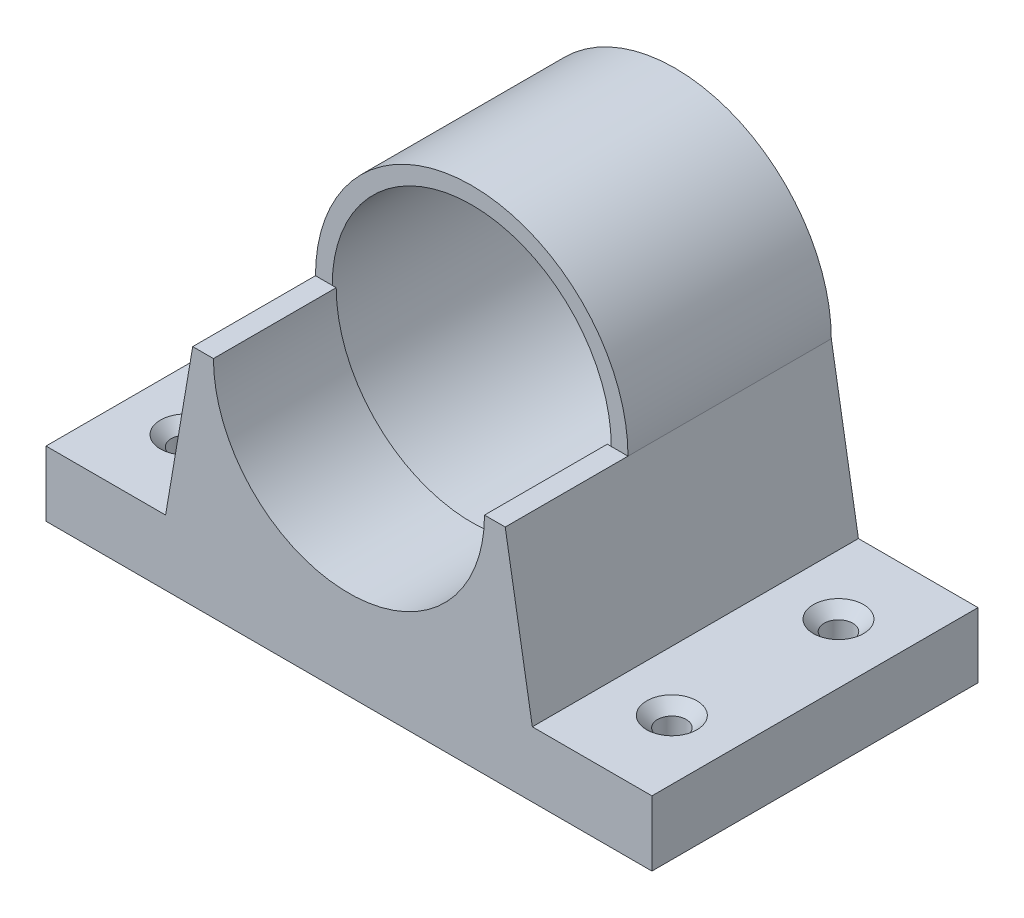
ISO-10303-21;
HEADER;
FILE_DESCRIPTION(('STEP AP214'),'2;1');
FILE_NAME('part.step','',(''),(''),'','','');
FILE_SCHEMA(('AUTOMOTIVE_DESIGN { 1 0 10303 214 1 1 1 1 }'));
ENDSEC;
DATA;
#1=APPLICATION_CONTEXT('core data for automotive mechanical design processes');
#2=APPLICATION_PROTOCOL_DEFINITION('international standard','automotive_design',2000,#1);
#3=PRODUCT_CONTEXT('',#1,'mechanical');
#4=PRODUCT('Part','Part','',(#3));
#5=PRODUCT_RELATED_PRODUCT_CATEGORY('part','',(#4));
#6=PRODUCT_DEFINITION_FORMATION('','',#4);
#7=PRODUCT_DEFINITION_CONTEXT('part definition',#1,'design');
#8=PRODUCT_DEFINITION('design','',#6,#7);
#9=PRODUCT_DEFINITION_SHAPE('','',#8);
#10=(LENGTH_UNIT() NAMED_UNIT(*) SI_UNIT(.MILLI.,.METRE.));
#11=(NAMED_UNIT(*) PLANE_ANGLE_UNIT() SI_UNIT($,.RADIAN.));
#12=(NAMED_UNIT(*) SI_UNIT($,.STERADIAN.) SOLID_ANGLE_UNIT());
#13=UNCERTAINTY_MEASURE_WITH_UNIT(LENGTH_MEASURE(1.E-05),#10,'distance_accuracy_value','');
#14=(GEOMETRIC_REPRESENTATION_CONTEXT(3) GLOBAL_UNCERTAINTY_ASSIGNED_CONTEXT((#13)) GLOBAL_UNIT_ASSIGNED_CONTEXT((#10,
#11,#12)) REPRESENTATION_CONTEXT('',''));
#15=CARTESIAN_POINT('',(0.,0.,0.));
#16=DIRECTION('',(0.,0.,1.));
#17=DIRECTION('',(1.,0.,0.));
#18=AXIS2_PLACEMENT_3D('',#15,#16,#17);
#19=CARTESIAN_POINT('',(0.,18.1533956791324,0.));
#20=DIRECTION('',(0.,0.,-1.));
#21=DIRECTION('',(-1.,0.,0.));
#22=AXIS2_PLACEMENT_3D('',#19,#20,#21);
#23=PLANE('',#22);
#24=CARTESIAN_POINT('',(0.,18.1533956791324,0.));
#25=DIRECTION('',(0.,0.,1.));
#26=DIRECTION('',(1.,0.,0.));
#27=AXIS2_PLACEMENT_3D('',#24,#25,#26);
#28=CIRCLE('',#27,17.5);
#29=CARTESIAN_POINT('',(17.5,18.1533956791324,0.));
#30=VERTEX_POINT('',#29);
#31=CARTESIAN_POINT('',(-17.5,18.1533956791324,0.));
#32=VERTEX_POINT('',#31);
#33=EDGE_CURVE('E300',#30,#32,#28,.T.);
#34=ORIENTED_EDGE('',*,*,#33,.F.);
#35=DIRECTION('',(1.,0.,0.));
#36=VECTOR('',#35,1.);
#37=CARTESIAN_POINT('',(0.,18.1533956791324,0.));
#38=LINE('',#37,#36);
#39=CARTESIAN_POINT('',(19.6,18.1533956791324,0.));
#40=VERTEX_POINT('',#39);
#41=EDGE_CURVE('E196',#30,#40,#38,.T.);
#42=ORIENTED_EDGE('',*,*,#41,.T.);
#43=CARTESIAN_POINT('',(0.,18.1533956791324,0.));
#44=DIRECTION('',(0.,0.,1.));
#45=DIRECTION('',(1.,0.,0.));
#46=AXIS2_PLACEMENT_3D('',#43,#44,#45);
#47=CIRCLE('',#46,19.6);
#48=CARTESIAN_POINT('',(-19.6,18.1533956791324,0.));
#49=VERTEX_POINT('',#48);
#50=EDGE_CURVE('E58',#40,#49,#47,.T.);
#51=ORIENTED_EDGE('',*,*,#50,.T.);
#52=DIRECTION('',(1.,0.,0.));
#53=VECTOR('',#52,1.);
#54=CARTESIAN_POINT('',(0.,18.1533956791324,0.));
#55=LINE('',#54,#53);
#56=EDGE_CURVE('E70',#49,#32,#55,.T.);
#57=ORIENTED_EDGE('',*,*,#56,.T.);
#58=EDGE_LOOP('',(#34,#42,#51,#57));
#59=FACE_BOUND('',#58,.T.);
#60=ADVANCED_FACE('F54',(#59),#23,.F.);
#61=CARTESIAN_POINT('',(0.,18.1533956791324,-25.5));
#62=DIRECTION('',(0.,0.,1.));
#63=DIRECTION('',(1.,0.,0.));
#64=AXIS2_PLACEMENT_3D('',#61,#62,#63);
#65=CYLINDRICAL_SURFACE('',#64,19.6);
#66=DIRECTION('',(0.,0.,-1.));
#67=VECTOR('',#66,1.);
#68=CARTESIAN_POINT('',(-19.6,18.1533956791324,15.4));
#69=LINE('',#68,#67);
#70=CARTESIAN_POINT('',(-19.6,18.1533956791324,-25.5));
#71=VERTEX_POINT('',#70);
#72=EDGE_CURVE('E301',#49,#71,#69,.T.);
#73=ORIENTED_EDGE('',*,*,#72,.F.);
#74=ORIENTED_EDGE('',*,*,#50,.F.);
#75=DIRECTION('',(0.,0.,-1.));
#76=VECTOR('',#75,1.);
#77=CARTESIAN_POINT('',(19.6,18.1533956791324,15.4));
#78=LINE('',#77,#76);
#79=CARTESIAN_POINT('',(19.6,18.1533956791324,-25.5));
#80=VERTEX_POINT('',#79);
#81=EDGE_CURVE('E296',#40,#80,#78,.T.);
#82=ORIENTED_EDGE('',*,*,#81,.T.);
#83=CARTESIAN_POINT('',(0.,18.1533956791324,-25.5));
#84=DIRECTION('',(0.,0.,-1.));
#85=DIRECTION('',(-1.,0.,0.));
#86=AXIS2_PLACEMENT_3D('',#83,#84,#85);
#87=CIRCLE('',#86,19.6);
#88=EDGE_CURVE('E12',#71,#80,#87,.T.);
#89=ORIENTED_EDGE('',*,*,#88,.F.);
#90=EDGE_LOOP('',(#73,#74,#82,#89));
#91=FACE_BOUND('',#90,.T.);
#92=ADVANCED_FACE('F56',(#91),#65,.T.);
#93=CARTESIAN_POINT('',(0.,18.1533956791324,-25.5));
#94=DIRECTION('',(0.,0.,-1.));
#95=DIRECTION('',(-1.,0.,0.));
#96=AXIS2_PLACEMENT_3D('',#93,#94,#95);
#97=PLANE('',#96);
#98=CARTESIAN_POINT('',(0.,18.1533956791324,-25.5));
#99=DIRECTION('',(0.,0.,1.));
#100=DIRECTION('',(1.,0.,0.));
#101=AXIS2_PLACEMENT_3D('',#98,#99,#100);
#102=CIRCLE('',#101,17.5);
#103=CARTESIAN_POINT('',(17.5,18.1533956791324,-25.5));
#104=VERTEX_POINT('',#103);
#105=EDGE_CURVE('E318',#104,#104,#102,.T.);
#106=ORIENTED_EDGE('',*,*,#105,.T.);
#107=EDGE_LOOP('',(#106));
#108=FACE_BOUND('',#107,.T.);
#109=ORIENTED_EDGE('',*,*,#88,.T.);
#110=DIRECTION('',(0.167595493933869,-0.985855846669817,0.));
#111=VECTOR('',#110,1.);
#112=CARTESIAN_POINT('',(19.6,18.1533956791324,-25.5));
#113=LINE('',#112,#111);
#114=CARTESIAN_POINT('',(23.,-1.84660432086758,-25.5));
#115=VERTEX_POINT('',#114);
#116=EDGE_CURVE('E260',#80,#115,#113,.T.);
#117=ORIENTED_EDGE('',*,*,#116,.T.);
#118=DIRECTION('',(1.,0.,0.));
#119=VECTOR('',#118,1.);
#120=CARTESIAN_POINT('',(23.,-1.84660432086758,-25.5));
#121=LINE('',#120,#119);
#122=CARTESIAN_POINT('',(38.,-1.84660432086758,-25.5));
#123=VERTEX_POINT('',#122);
#124=EDGE_CURVE('E264',#115,#123,#121,.T.);
#125=ORIENTED_EDGE('',*,*,#124,.T.);
#126=DIRECTION('',(0.,-1.,0.));
#127=VECTOR('',#126,1.);
#128=CARTESIAN_POINT('',(38.,-1.84660432086758,-25.5));
#129=LINE('',#128,#127);
#130=CARTESIAN_POINT('',(38.,-10.0216043208676,-25.5));
#131=VERTEX_POINT('',#130);
#132=EDGE_CURVE('E268',#123,#131,#129,.T.);
#133=ORIENTED_EDGE('',*,*,#132,.T.);
#134=DIRECTION('',(1.,0.,0.));
#135=VECTOR('',#134,1.);
#136=CARTESIAN_POINT('',(0.,-10.0216043208676,-25.5));
#137=LINE('',#136,#135);
#138=CARTESIAN_POINT('',(-38.,-10.0216043208676,-25.5));
#139=VERTEX_POINT('',#138);
#140=EDGE_CURVE('E168',#139,#131,#137,.T.);
#141=ORIENTED_EDGE('',*,*,#140,.F.);
#142=DIRECTION('',(0.,-1.,0.));
#143=VECTOR('',#142,1.);
#144=CARTESIAN_POINT('',(-38.,-1.84660432086758,-25.5));
#145=LINE('',#144,#143);
#146=CARTESIAN_POINT('',(-38.,-1.84660432086758,-25.5));
#147=VERTEX_POINT('',#146);
#148=EDGE_CURVE('E163',#147,#139,#145,.T.);
#149=ORIENTED_EDGE('',*,*,#148,.F.);
#150=DIRECTION('',(-1.,0.,0.));
#151=VECTOR('',#150,1.);
#152=CARTESIAN_POINT('',(-23.,-1.84660432086758,-25.5));
#153=LINE('',#152,#151);
#154=CARTESIAN_POINT('',(-23.,-1.84660432086758,-25.5));
#155=VERTEX_POINT('',#154);
#156=EDGE_CURVE('E273',#155,#147,#153,.T.);
#157=ORIENTED_EDGE('',*,*,#156,.F.);
#158=DIRECTION('',(0.167595493933869,0.985855846669817,0.));
#159=VECTOR('',#158,1.);
#160=CARTESIAN_POINT('',(-23.,-1.84660432086758,-25.5));
#161=LINE('',#160,#159);
#162=EDGE_CURVE('E277',#155,#71,#161,.T.);
#163=ORIENTED_EDGE('',*,*,#162,.T.);
#164=EDGE_LOOP('',(#109,#117,#125,#133,#141,#149,#157,#163));
#165=FACE_BOUND('',#164,.T.);
#166=ADVANCED_FACE('F356',(#108,#165),#97,.T.);
#167=CARTESIAN_POINT('',(0.,18.1533956791324,-25.5));
#168=DIRECTION('',(0.,0.,1.));
#169=DIRECTION('',(1.,0.,0.));
#170=AXIS2_PLACEMENT_3D('',#167,#168,#169);
#171=CYLINDRICAL_SURFACE('',#170,17.5);
#172=ORIENTED_EDGE('',*,*,#105,.F.);
#173=EDGE_LOOP('',(#172));
#174=FACE_BOUND('',#173,.T.);
#175=ORIENTED_EDGE('',*,*,#33,.T.);
#176=CARTESIAN_POINT('',(0.,18.1533956791324,0.));
#177=DIRECTION('',(0.,0.,1.));
#178=DIRECTION('',(1.,0.,0.));
#179=AXIS2_PLACEMENT_3D('',#176,#177,#178);
#180=CIRCLE('',#179,17.5);
#181=EDGE_CURVE('E76',#30,#32,#180,.F.);
#182=ORIENTED_EDGE('',*,*,#181,.F.);
#183=EDGE_LOOP('',(#175,#182));
#184=FACE_BOUND('',#183,.T.);
#185=ADVANCED_FACE('F323',(#174,#184),#171,.F.);
#186=CARTESIAN_POINT('',(-23.,-1.84660432086758,15.4));
#187=DIRECTION('',(-0.985855846669818,0.167595493933869,0.));
#188=DIRECTION('',(-0.167595493933869,-0.985855846669818,0.));
#189=AXIS2_PLACEMENT_3D('',#186,#187,#188);
#190=PLANE('',#189);
#191=CARTESIAN_POINT('',(-19.6,18.1533956791324,15.4));
#192=VERTEX_POINT('',#191);
#193=EDGE_CURVE('E297',#192,#49,#69,.T.);
#194=ORIENTED_EDGE('',*,*,#193,.T.);
#195=ORIENTED_EDGE('',*,*,#72,.T.);
#196=ORIENTED_EDGE('',*,*,#162,.F.);
#197=DIRECTION('',(0.,0.,-1.));
#198=VECTOR('',#197,1.);
#199=CARTESIAN_POINT('',(-23.,-1.84660432086758,15.4));
#200=LINE('',#199,#198);
#201=CARTESIAN_POINT('',(-23.,-1.84660432086758,15.4));
#202=VERTEX_POINT('',#201);
#203=EDGE_CURVE('E302',#202,#155,#200,.T.);
#204=ORIENTED_EDGE('',*,*,#203,.F.);
#205=DIRECTION('',(0.167595493933869,0.985855846669817,0.));
#206=VECTOR('',#205,1.);
#207=CARTESIAN_POINT('',(-23.,-1.84660432086758,15.4));
#208=LINE('',#207,#206);
#209=EDGE_CURVE('E293',#202,#192,#208,.T.);
#210=ORIENTED_EDGE('',*,*,#209,.T.);
#211=EDGE_LOOP('',(#194,#195,#196,#204,#210));
#212=FACE_BOUND('',#211,.T.);
#213=ADVANCED_FACE('F366',(#212),#190,.T.);
#214=CARTESIAN_POINT('',(-23.,-1.84660432086758,15.4));
#215=DIRECTION('',(0.,-1.,0.));
#216=DIRECTION('',(1.,0.,0.));
#217=AXIS2_PLACEMENT_3D('',#214,#215,#216);
#218=PLANE('',#217);
#219=CARTESIAN_POINT('',(-30.5,-1.84660432086758,-15.5));
#220=DIRECTION('',(0.,1.,0.));
#221=DIRECTION('',(0.,0.,1.));
#222=AXIS2_PLACEMENT_3D('',#219,#220,#221);
#223=CIRCLE('',#222,3.15);
#224=CARTESIAN_POINT('',(-30.5,-1.84660432086758,-12.35));
#225=VERTEX_POINT('',#224);
#226=EDGE_CURVE('E244',#225,#225,#223,.T.);
#227=ORIENTED_EDGE('',*,*,#226,.F.);
#228=EDGE_LOOP('',(#227));
#229=FACE_BOUND('',#228,.T.);
#230=CARTESIAN_POINT('',(-30.5,-1.84660432086758,5.4));
#231=DIRECTION('',(0.,1.,0.));
#232=DIRECTION('',(0.,0.,1.));
#233=AXIS2_PLACEMENT_3D('',#230,#231,#232);
#234=CIRCLE('',#233,3.15);
#235=CARTESIAN_POINT('',(-30.5,-1.84660432086758,8.55));
#236=VERTEX_POINT('',#235);
#237=EDGE_CURVE('E252',#236,#236,#234,.T.);
#238=ORIENTED_EDGE('',*,*,#237,.F.);
#239=EDGE_LOOP('',(#238));
#240=FACE_BOUND('',#239,.T.);
#241=ORIENTED_EDGE('',*,*,#203,.T.);
#242=ORIENTED_EDGE('',*,*,#156,.T.);
#243=DIRECTION('',(0.,0.,-1.));
#244=VECTOR('',#243,1.);
#245=CARTESIAN_POINT('',(-38.,-1.84660432086758,15.4));
#246=LINE('',#245,#244);
#247=CARTESIAN_POINT('',(-38.,-1.84660432086758,15.4));
#248=VERTEX_POINT('',#247);
#249=EDGE_CURVE('E305',#248,#147,#246,.T.);
#250=ORIENTED_EDGE('',*,*,#249,.F.);
#251=DIRECTION('',(-1.,0.,0.));
#252=VECTOR('',#251,1.);
#253=CARTESIAN_POINT('',(-23.,-1.84660432086758,15.4));
#254=LINE('',#253,#252);
#255=EDGE_CURVE('E153',#202,#248,#254,.T.);
#256=ORIENTED_EDGE('',*,*,#255,.F.);
#257=EDGE_LOOP('',(#241,#242,#250,#256));
#258=FACE_BOUND('',#257,.T.);
#259=ADVANCED_FACE('F363',(#229,#240,#258),#218,.F.);
#260=CARTESIAN_POINT('',(-38.,-1.84660432086758,15.4));
#261=DIRECTION('',(1.,0.,0.));
#262=DIRECTION('',(0.,0.,-1.));
#263=AXIS2_PLACEMENT_3D('',#260,#261,#262);
#264=PLANE('',#263);
#265=ORIENTED_EDGE('',*,*,#249,.T.);
#266=ORIENTED_EDGE('',*,*,#148,.T.);
#267=DIRECTION('',(0.,0.,-1.));
#268=VECTOR('',#267,1.);
#269=CARTESIAN_POINT('',(-38.,-10.0216043208676,0.));
#270=LINE('',#269,#268);
#271=CARTESIAN_POINT('',(-38.,-10.0216043208676,15.4));
#272=VERTEX_POINT('',#271);
#273=EDGE_CURVE('E160',#272,#139,#270,.T.);
#274=ORIENTED_EDGE('',*,*,#273,.F.);
#275=DIRECTION('',(0.,-1.,0.));
#276=VECTOR('',#275,1.);
#277=CARTESIAN_POINT('',(-38.,-1.84660432086758,15.4));
#278=LINE('',#277,#276);
#279=EDGE_CURVE('E145',#248,#272,#278,.T.);
#280=ORIENTED_EDGE('',*,*,#279,.F.);
#281=EDGE_LOOP('',(#265,#266,#274,#280));
#282=FACE_BOUND('',#281,.T.);
#283=ADVANCED_FACE('F161',(#282),#264,.F.);
#284=CARTESIAN_POINT('',(38.,-1.84660432086758,15.4));
#285=DIRECTION('',(1.,0.,0.));
#286=DIRECTION('',(0.,0.,-1.));
#287=AXIS2_PLACEMENT_3D('',#284,#285,#286);
#288=PLANE('',#287);
#289=DIRECTION('',(0.,-1.,0.));
#290=VECTOR('',#289,1.);
#291=CARTESIAN_POINT('',(38.,-1.84660432086758,15.4));
#292=LINE('',#291,#290);
#293=CARTESIAN_POINT('',(38.,-1.84660432086758,15.4));
#294=VERTEX_POINT('',#293);
#295=CARTESIAN_POINT('',(38.,-10.0216043208676,15.4));
#296=VERTEX_POINT('',#295);
#297=EDGE_CURVE('E157',#294,#296,#292,.T.);
#298=ORIENTED_EDGE('',*,*,#297,.T.);
#299=DIRECTION('',(0.,0.,1.));
#300=VECTOR('',#299,1.);
#301=CARTESIAN_POINT('',(38.,-10.0216043208676,0.));
#302=LINE('',#301,#300);
#303=EDGE_CURVE('E174',#131,#296,#302,.T.);
#304=ORIENTED_EDGE('',*,*,#303,.F.);
#305=ORIENTED_EDGE('',*,*,#132,.F.);
#306=DIRECTION('',(0.,0.,-1.));
#307=VECTOR('',#306,1.);
#308=CARTESIAN_POINT('',(38.,-1.84660432086758,15.4));
#309=LINE('',#308,#307);
#310=EDGE_CURVE('E308',#294,#123,#309,.T.);
#311=ORIENTED_EDGE('',*,*,#310,.F.);
#312=EDGE_LOOP('',(#298,#304,#305,#311));
#313=FACE_BOUND('',#312,.T.);
#314=ADVANCED_FACE('F360',(#313),#288,.T.);
#315=CARTESIAN_POINT('',(23.,-1.84660432086758,15.4));
#316=DIRECTION('',(0.,1.,0.));
#317=DIRECTION('',(-1.,0.,0.));
#318=AXIS2_PLACEMENT_3D('',#315,#316,#317);
#319=PLANE('',#318);
#320=CARTESIAN_POINT('',(30.5,-1.84660432086758,5.4));
#321=DIRECTION('',(0.,1.,0.));
#322=DIRECTION('',(0.,0.,1.));
#323=AXIS2_PLACEMENT_3D('',#320,#321,#322);
#324=CIRCLE('',#323,3.15);
#325=CARTESIAN_POINT('',(30.5,-1.84660432086758,8.55));
#326=VERTEX_POINT('',#325);
#327=EDGE_CURVE('E228',#326,#326,#324,.T.);
#328=ORIENTED_EDGE('',*,*,#327,.F.);
#329=EDGE_LOOP('',(#328));
#330=FACE_BOUND('',#329,.T.);
#331=CARTESIAN_POINT('',(30.5,-1.84660432086758,-15.5));
#332=DIRECTION('',(0.,1.,0.));
#333=DIRECTION('',(0.,0.,1.));
#334=AXIS2_PLACEMENT_3D('',#331,#332,#333);
#335=CIRCLE('',#334,3.15);
#336=CARTESIAN_POINT('',(30.5,-1.84660432086758,-12.35));
#337=VERTEX_POINT('',#336);
#338=EDGE_CURVE('E236',#337,#337,#335,.T.);
#339=ORIENTED_EDGE('',*,*,#338,.F.);
#340=EDGE_LOOP('',(#339));
#341=FACE_BOUND('',#340,.T.);
#342=ORIENTED_EDGE('',*,*,#310,.T.);
#343=ORIENTED_EDGE('',*,*,#124,.F.);
#344=DIRECTION('',(0.,0.,-1.));
#345=VECTOR('',#344,1.);
#346=CARTESIAN_POINT('',(23.,-1.84660432086758,15.4));
#347=LINE('',#346,#345);
#348=CARTESIAN_POINT('',(23.,-1.84660432086758,15.4));
#349=VERTEX_POINT('',#348);
#350=EDGE_CURVE('E311',#349,#115,#347,.T.);
#351=ORIENTED_EDGE('',*,*,#350,.F.);
#352=DIRECTION('',(1.,0.,0.));
#353=VECTOR('',#352,1.);
#354=CARTESIAN_POINT('',(23.,-1.84660432086758,15.4));
#355=LINE('',#354,#353);
#356=EDGE_CURVE('E285',#349,#294,#355,.T.);
#357=ORIENTED_EDGE('',*,*,#356,.T.);
#358=EDGE_LOOP('',(#342,#343,#351,#357));
#359=FACE_BOUND('',#358,.T.);
#360=ADVANCED_FACE('F358',(#330,#341,#359),#319,.T.);
#361=CARTESIAN_POINT('',(19.6,18.1533956791324,15.4));
#362=DIRECTION('',(0.985855846669818,0.167595493933869,0.));
#363=DIRECTION('',(-0.167595493933869,0.985855846669818,0.));
#364=AXIS2_PLACEMENT_3D('',#361,#362,#363);
#365=PLANE('',#364);
#366=ORIENTED_EDGE('',*,*,#350,.T.);
#367=ORIENTED_EDGE('',*,*,#116,.F.);
#368=ORIENTED_EDGE('',*,*,#81,.F.);
#369=CARTESIAN_POINT('',(19.6,18.1533956791324,15.4));
#370=VERTEX_POINT('',#369);
#371=EDGE_CURVE('E314',#370,#40,#78,.T.);
#372=ORIENTED_EDGE('',*,*,#371,.F.);
#373=DIRECTION('',(0.167595493933869,-0.985855846669817,0.));
#374=VECTOR('',#373,1.);
#375=CARTESIAN_POINT('',(19.6,18.1533956791324,15.4));
#376=LINE('',#375,#374);
#377=EDGE_CURVE('E281',#370,#349,#376,.T.);
#378=ORIENTED_EDGE('',*,*,#377,.T.);
#379=EDGE_LOOP('',(#366,#367,#368,#372,#378));
#380=FACE_BOUND('',#379,.T.);
#381=ADVANCED_FACE('F342',(#380),#365,.T.);
#382=CARTESIAN_POINT('',(0.,18.1533956791324,15.4));
#383=DIRECTION('',(0.,0.,1.));
#384=DIRECTION('',(1.,0.,0.));
#385=AXIS2_PLACEMENT_3D('',#382,#383,#384);
#386=PLANE('',#385);
#387=ORIENTED_EDGE('',*,*,#377,.F.);
#388=DIRECTION('',(1.,0.,0.));
#389=VECTOR('',#388,1.);
#390=CARTESIAN_POINT('',(0.,18.1533956791324,15.4));
#391=LINE('',#390,#389);
#392=CARTESIAN_POINT('',(17.,18.1533956791324,15.4));
#393=VERTEX_POINT('',#392);
#394=EDGE_CURVE('E197',#393,#370,#391,.T.);
#395=ORIENTED_EDGE('',*,*,#394,.F.);
#396=CARTESIAN_POINT('',(0.,18.1533956791324,15.4));
#397=DIRECTION('',(0.,0.,1.));
#398=DIRECTION('',(1.,0.,0.));
#399=AXIS2_PLACEMENT_3D('',#396,#397,#398);
#400=CIRCLE('',#399,17.);
#401=CARTESIAN_POINT('',(-17.,18.1533956791324,15.4));
#402=VERTEX_POINT('',#401);
#403=EDGE_CURVE('E201',#393,#402,#400,.F.);
#404=ORIENTED_EDGE('',*,*,#403,.T.);
#405=DIRECTION('',(1.,0.,0.));
#406=VECTOR('',#405,1.);
#407=CARTESIAN_POINT('',(0.,18.1533956791324,15.4));
#408=LINE('',#407,#406);
#409=EDGE_CURVE('E204',#192,#402,#408,.T.);
#410=ORIENTED_EDGE('',*,*,#409,.F.);
#411=ORIENTED_EDGE('',*,*,#209,.F.);
#412=ORIENTED_EDGE('',*,*,#255,.T.);
#413=ORIENTED_EDGE('',*,*,#279,.T.);
#414=DIRECTION('',(-1.,0.,0.));
#415=VECTOR('',#414,1.);
#416=CARTESIAN_POINT('',(0.,-10.0216043208676,15.4));
#417=LINE('',#416,#415);
#418=EDGE_CURVE('E150',#296,#272,#417,.T.);
#419=ORIENTED_EDGE('',*,*,#418,.F.);
#420=ORIENTED_EDGE('',*,*,#297,.F.);
#421=ORIENTED_EDGE('',*,*,#356,.F.);
#422=EDGE_LOOP('',(#387,#395,#404,#410,#411,#412,#413,#419,#420,#421));
#423=FACE_BOUND('',#422,.T.);
#424=ADVANCED_FACE('F147',(#423),#386,.T.);
#425=CARTESIAN_POINT('',(-30.5,-1.84660432086758,5.4));
#426=DIRECTION('',(0.,1.,0.));
#427=DIRECTION('',(0.,0.,1.));
#428=AXIS2_PLACEMENT_3D('',#425,#426,#427);
#429=CYLINDRICAL_SURFACE('',#428,1.8);
#430=CARTESIAN_POINT('',(-30.5,-3.19660432086758,5.4));
#431=DIRECTION('',(0.,1.,0.));
#432=DIRECTION('',(0.,0.,1.));
#433=AXIS2_PLACEMENT_3D('',#430,#431,#432);
#434=CIRCLE('',#433,1.8);
#435=CARTESIAN_POINT('',(-30.5,-3.19660432086758,7.2));
#436=VERTEX_POINT('',#435);
#437=EDGE_CURVE('E256',#436,#436,#434,.T.);
#438=ORIENTED_EDGE('',*,*,#437,.T.);
#439=EDGE_LOOP('',(#438));
#440=FACE_BOUND('',#439,.T.);
#441=CARTESIAN_POINT('',(-30.5,-10.0216043208676,5.4));
#442=DIRECTION('',(0.,-1.,0.));
#443=DIRECTION('',(0.,0.,-1.));
#444=AXIS2_PLACEMENT_3D('',#441,#442,#443);
#445=CIRCLE('',#444,1.8);
#446=CARTESIAN_POINT('',(-30.5,-10.0216043208676,3.6));
#447=VERTEX_POINT('',#446);
#448=EDGE_CURVE('E176',#447,#447,#445,.F.);
#449=ORIENTED_EDGE('',*,*,#448,.F.);
#450=EDGE_LOOP('',(#449));
#451=FACE_BOUND('',#450,.T.);
#452=ADVANCED_FACE('F421',(#440,#451),#429,.F.);
#453=CARTESIAN_POINT('',(-30.5,-1.84660432086758,5.4));
#454=DIRECTION('',(0.,1.,0.));
#455=DIRECTION('',(0.,0.,1.));
#456=AXIS2_PLACEMENT_3D('',#453,#454,#455);
#457=CONICAL_SURFACE('',#456,3.15,0.785398163397448);
#458=ORIENTED_EDGE('',*,*,#437,.F.);
#459=EDGE_LOOP('',(#458));
#460=FACE_BOUND('',#459,.T.);
#461=ORIENTED_EDGE('',*,*,#237,.T.);
#462=EDGE_LOOP('',(#461));
#463=FACE_BOUND('',#462,.T.);
#464=ADVANCED_FACE('F427',(#460,#463),#457,.F.);
#465=CARTESIAN_POINT('',(-30.5,-1.84660432086758,-15.5));
#466=DIRECTION('',(0.,1.,0.));
#467=DIRECTION('',(0.,0.,1.));
#468=AXIS2_PLACEMENT_3D('',#465,#466,#467);
#469=CYLINDRICAL_SURFACE('',#468,1.8);
#470=CARTESIAN_POINT('',(-30.5,-3.19660432086758,-15.5));
#471=DIRECTION('',(0.,1.,0.));
#472=DIRECTION('',(0.,0.,1.));
#473=AXIS2_PLACEMENT_3D('',#470,#471,#472);
#474=CIRCLE('',#473,1.8);
#475=CARTESIAN_POINT('',(-30.5,-3.19660432086758,-13.7));
#476=VERTEX_POINT('',#475);
#477=EDGE_CURVE('E248',#476,#476,#474,.T.);
#478=ORIENTED_EDGE('',*,*,#477,.T.);
#479=EDGE_LOOP('',(#478));
#480=FACE_BOUND('',#479,.T.);
#481=CARTESIAN_POINT('',(-30.5,-10.0216043208676,-15.5));
#482=DIRECTION('',(0.,-1.,0.));
#483=DIRECTION('',(0.,0.,-1.));
#484=AXIS2_PLACEMENT_3D('',#481,#482,#483);
#485=CIRCLE('',#484,1.8);
#486=CARTESIAN_POINT('',(-30.5,-10.0216043208676,-17.3));
#487=VERTEX_POINT('',#486);
#488=EDGE_CURVE('E188',#487,#487,#485,.F.);
#489=ORIENTED_EDGE('',*,*,#488,.F.);
#490=EDGE_LOOP('',(#489));
#491=FACE_BOUND('',#490,.T.);
#492=ADVANCED_FACE('F436',(#480,#491),#469,.F.);
#493=CARTESIAN_POINT('',(-30.5,-1.84660432086758,-15.5));
#494=DIRECTION('',(0.,1.,0.));
#495=DIRECTION('',(0.,0.,1.));
#496=AXIS2_PLACEMENT_3D('',#493,#494,#495);
#497=CONICAL_SURFACE('',#496,3.15,0.785398163397448);
#498=ORIENTED_EDGE('',*,*,#477,.F.);
#499=EDGE_LOOP('',(#498));
#500=FACE_BOUND('',#499,.T.);
#501=ORIENTED_EDGE('',*,*,#226,.T.);
#502=EDGE_LOOP('',(#501));
#503=FACE_BOUND('',#502,.T.);
#504=ADVANCED_FACE('F443',(#500,#503),#497,.F.);
#505=CARTESIAN_POINT('',(30.5,-1.84660432086758,-15.5));
#506=DIRECTION('',(0.,1.,0.));
#507=DIRECTION('',(0.,0.,1.));
#508=AXIS2_PLACEMENT_3D('',#505,#506,#507);
#509=CYLINDRICAL_SURFACE('',#508,1.79999999999999);
#510=CARTESIAN_POINT('',(30.5,-3.19660432086759,-15.5));
#511=DIRECTION('',(0.,1.,0.));
#512=DIRECTION('',(0.,0.,1.));
#513=AXIS2_PLACEMENT_3D('',#510,#511,#512);
#514=CIRCLE('',#513,1.79999999999999);
#515=CARTESIAN_POINT('',(30.5,-3.19660432086759,-13.7));
#516=VERTEX_POINT('',#515);
#517=EDGE_CURVE('E240',#516,#516,#514,.T.);
#518=ORIENTED_EDGE('',*,*,#517,.T.);
#519=EDGE_LOOP('',(#518));
#520=FACE_BOUND('',#519,.T.);
#521=CARTESIAN_POINT('',(30.5,-10.0216043208676,-15.5));
#522=DIRECTION('',(0.,-1.,0.));
#523=DIRECTION('',(0.,0.,-1.));
#524=AXIS2_PLACEMENT_3D('',#521,#522,#523);
#525=CIRCLE('',#524,1.8);
#526=CARTESIAN_POINT('',(30.5,-10.0216043208676,-17.3));
#527=VERTEX_POINT('',#526);
#528=EDGE_CURVE('E180',#527,#527,#525,.F.);
#529=ORIENTED_EDGE('',*,*,#528,.F.);
#530=EDGE_LOOP('',(#529));
#531=FACE_BOUND('',#530,.T.);
#532=ADVANCED_FACE('F451',(#520,#531),#509,.F.);
#533=CARTESIAN_POINT('',(30.5,-1.84660432086758,-15.5));
#534=DIRECTION('',(0.,1.,0.));
#535=DIRECTION('',(0.,0.,1.));
#536=AXIS2_PLACEMENT_3D('',#533,#534,#535);
#537=CONICAL_SURFACE('',#536,3.15,0.78539816339745);
#538=ORIENTED_EDGE('',*,*,#517,.F.);
#539=EDGE_LOOP('',(#538));
#540=FACE_BOUND('',#539,.T.);
#541=ORIENTED_EDGE('',*,*,#338,.T.);
#542=EDGE_LOOP('',(#541));
#543=FACE_BOUND('',#542,.T.);
#544=ADVANCED_FACE('F458',(#540,#543),#537,.F.);
#545=CARTESIAN_POINT('',(30.5,-1.84660432086758,5.4));
#546=DIRECTION('',(0.,1.,0.));
#547=DIRECTION('',(0.,0.,1.));
#548=AXIS2_PLACEMENT_3D('',#545,#546,#547);
#549=CYLINDRICAL_SURFACE('',#548,1.79999999999999);
#550=CARTESIAN_POINT('',(30.5,-3.19660432086759,5.4));
#551=DIRECTION('',(0.,1.,0.));
#552=DIRECTION('',(0.,0.,1.));
#553=AXIS2_PLACEMENT_3D('',#550,#551,#552);
#554=CIRCLE('',#553,1.79999999999999);
#555=CARTESIAN_POINT('',(30.5,-3.19660432086759,7.19999999999998));
#556=VERTEX_POINT('',#555);
#557=EDGE_CURVE('E232',#556,#556,#554,.T.);
#558=ORIENTED_EDGE('',*,*,#557,.T.);
#559=EDGE_LOOP('',(#558));
#560=FACE_BOUND('',#559,.T.);
#561=CARTESIAN_POINT('',(30.5,-10.0216043208676,5.4));
#562=DIRECTION('',(0.,-1.,0.));
#563=DIRECTION('',(0.,0.,-1.));
#564=AXIS2_PLACEMENT_3D('',#561,#562,#563);
#565=CIRCLE('',#564,1.8);
#566=CARTESIAN_POINT('',(30.5,-10.0216043208676,3.6));
#567=VERTEX_POINT('',#566);
#568=EDGE_CURVE('E192',#567,#567,#565,.F.);
#569=ORIENTED_EDGE('',*,*,#568,.F.);
#570=EDGE_LOOP('',(#569));
#571=FACE_BOUND('',#570,.T.);
#572=ADVANCED_FACE('F466',(#560,#571),#549,.F.);
#573=CARTESIAN_POINT('',(30.5,-1.84660432086758,5.4));
#574=DIRECTION('',(0.,1.,0.));
#575=DIRECTION('',(0.,0.,1.));
#576=AXIS2_PLACEMENT_3D('',#573,#574,#575);
#577=CONICAL_SURFACE('',#576,3.15,0.785398163397453);
#578=ORIENTED_EDGE('',*,*,#557,.F.);
#579=EDGE_LOOP('',(#578));
#580=FACE_BOUND('',#579,.T.);
#581=ORIENTED_EDGE('',*,*,#327,.T.);
#582=EDGE_LOOP('',(#581));
#583=FACE_BOUND('',#582,.T.);
#584=ADVANCED_FACE('F474',(#580,#583),#577,.F.);
#585=CARTESIAN_POINT('',(0.,0.,0.));
#586=DIRECTION('',(0.,0.,1.));
#587=DIRECTION('',(1.,0.,0.));
#588=AXIS2_PLACEMENT_3D('',#585,#586,#587);
#589=PLANE('',#588);
#590=CARTESIAN_POINT('',(17.,18.1533956791324,0.));
#591=VERTEX_POINT('',#590);
#592=EDGE_CURVE('E209',#591,#30,#38,.T.);
#593=ORIENTED_EDGE('',*,*,#592,.T.);
#594=ORIENTED_EDGE('',*,*,#181,.T.);
#595=CARTESIAN_POINT('',(-17.,18.1533956791324,0.));
#596=VERTEX_POINT('',#595);
#597=EDGE_CURVE('E217',#32,#596,#55,.T.);
#598=ORIENTED_EDGE('',*,*,#597,.T.);
#599=CARTESIAN_POINT('',(0.,18.1533956791324,0.));
#600=DIRECTION('',(0.,0.,1.));
#601=DIRECTION('',(1.,0.,0.));
#602=AXIS2_PLACEMENT_3D('',#599,#600,#601);
#603=CIRCLE('',#602,17.);
#604=EDGE_CURVE('E213',#591,#596,#603,.F.);
#605=ORIENTED_EDGE('',*,*,#604,.F.);
#606=EDGE_LOOP('',(#593,#594,#598,#605));
#607=FACE_BOUND('',#606,.T.);
#608=ADVANCED_FACE('F327',(#607),#589,.F.);
#609=CARTESIAN_POINT('',(0.,18.1533956791324,15.4));
#610=DIRECTION('',(0.,1.,0.));
#611=DIRECTION('',(0.,0.,1.));
#612=AXIS2_PLACEMENT_3D('',#609,#610,#611);
#613=PLANE('',#612);
#614=ORIENTED_EDGE('',*,*,#592,.F.);
#615=DIRECTION('',(0.,0.,-1.));
#616=VECTOR('',#615,1.);
#617=CARTESIAN_POINT('',(17.,18.1533956791324,15.4));
#618=LINE('',#617,#616);
#619=EDGE_CURVE('E223',#393,#591,#618,.T.);
#620=ORIENTED_EDGE('',*,*,#619,.F.);
#621=ORIENTED_EDGE('',*,*,#394,.T.);
#622=ORIENTED_EDGE('',*,*,#371,.T.);
#623=ORIENTED_EDGE('',*,*,#41,.F.);
#624=EDGE_LOOP('',(#614,#620,#621,#622,#623));
#625=FACE_BOUND('',#624,.T.);
#626=ADVANCED_FACE('F348',(#625),#613,.T.);
#627=CARTESIAN_POINT('',(0.,18.1533956791324,15.4));
#628=DIRECTION('',(0.,0.,-1.));
#629=DIRECTION('',(-1.,0.,0.));
#630=AXIS2_PLACEMENT_3D('',#627,#628,#629);
#631=CYLINDRICAL_SURFACE('',#630,17.);
#632=ORIENTED_EDGE('',*,*,#604,.T.);
#633=DIRECTION('',(0.,0.,-1.));
#634=VECTOR('',#633,1.);
#635=CARTESIAN_POINT('',(-17.,18.1533956791324,15.4));
#636=LINE('',#635,#634);
#637=EDGE_CURVE('E208',#402,#596,#636,.T.);
#638=ORIENTED_EDGE('',*,*,#637,.F.);
#639=ORIENTED_EDGE('',*,*,#403,.F.);
#640=ORIENTED_EDGE('',*,*,#619,.T.);
#641=EDGE_LOOP('',(#632,#638,#639,#640));
#642=FACE_BOUND('',#641,.T.);
#643=ADVANCED_FACE('F494',(#642),#631,.F.);
#644=CARTESIAN_POINT('',(0.,18.1533956791324,15.4));
#645=DIRECTION('',(0.,1.,0.));
#646=DIRECTION('',(0.,0.,1.));
#647=AXIS2_PLACEMENT_3D('',#644,#645,#646);
#648=PLANE('',#647);
#649=ORIENTED_EDGE('',*,*,#56,.F.);
#650=ORIENTED_EDGE('',*,*,#193,.F.);
#651=ORIENTED_EDGE('',*,*,#409,.T.);
#652=ORIENTED_EDGE('',*,*,#637,.T.);
#653=ORIENTED_EDGE('',*,*,#597,.F.);
#654=EDGE_LOOP('',(#649,#650,#651,#652,#653));
#655=FACE_BOUND('',#654,.T.);
#656=ADVANCED_FACE('F331',(#655),#648,.T.);
#657=CARTESIAN_POINT('',(0.,-10.0216043208676,0.));
#658=DIRECTION('',(0.,-1.,0.));
#659=DIRECTION('',(0.,0.,-1.));
#660=AXIS2_PLACEMENT_3D('',#657,#658,#659);
#661=PLANE('',#660);
#662=ORIENTED_EDGE('',*,*,#528,.T.);
#663=EDGE_LOOP('',(#662));
#664=FACE_BOUND('',#663,.T.);
#665=ORIENTED_EDGE('',*,*,#448,.T.);
#666=EDGE_LOOP('',(#665));
#667=FACE_BOUND('',#666,.T.);
#668=ORIENTED_EDGE('',*,*,#418,.T.);
#669=ORIENTED_EDGE('',*,*,#273,.T.);
#670=ORIENTED_EDGE('',*,*,#140,.T.);
#671=ORIENTED_EDGE('',*,*,#303,.T.);
#672=EDGE_LOOP('',(#668,#669,#670,#671));
#673=FACE_BOUND('',#672,.T.);
#674=ORIENTED_EDGE('',*,*,#488,.T.);
#675=EDGE_LOOP('',(#674));
#676=FACE_BOUND('',#675,.T.);
#677=ORIENTED_EDGE('',*,*,#568,.T.);
#678=EDGE_LOOP('',(#677));
#679=FACE_BOUND('',#678,.T.);
#680=ADVANCED_FACE('F171',(#664,#667,#673,#676,#679),#661,.T.);
#681=CLOSED_SHELL('',(#60,#92,#166,#185,#213,#259,#283,#314,#360,#381,#424,#452,#464,#492,#504,
#532,#544,#572,#584,#608,#626,#643,#656,#680));
#682=MANIFOLD_SOLID_BREP('B2',#681);
#683=ADVANCED_BREP_SHAPE_REPRESENTATION('',(#18,#682),#14);
#684=SHAPE_DEFINITION_REPRESENTATION(#9,#683);
ENDSEC;
END-ISO-10303-21;
